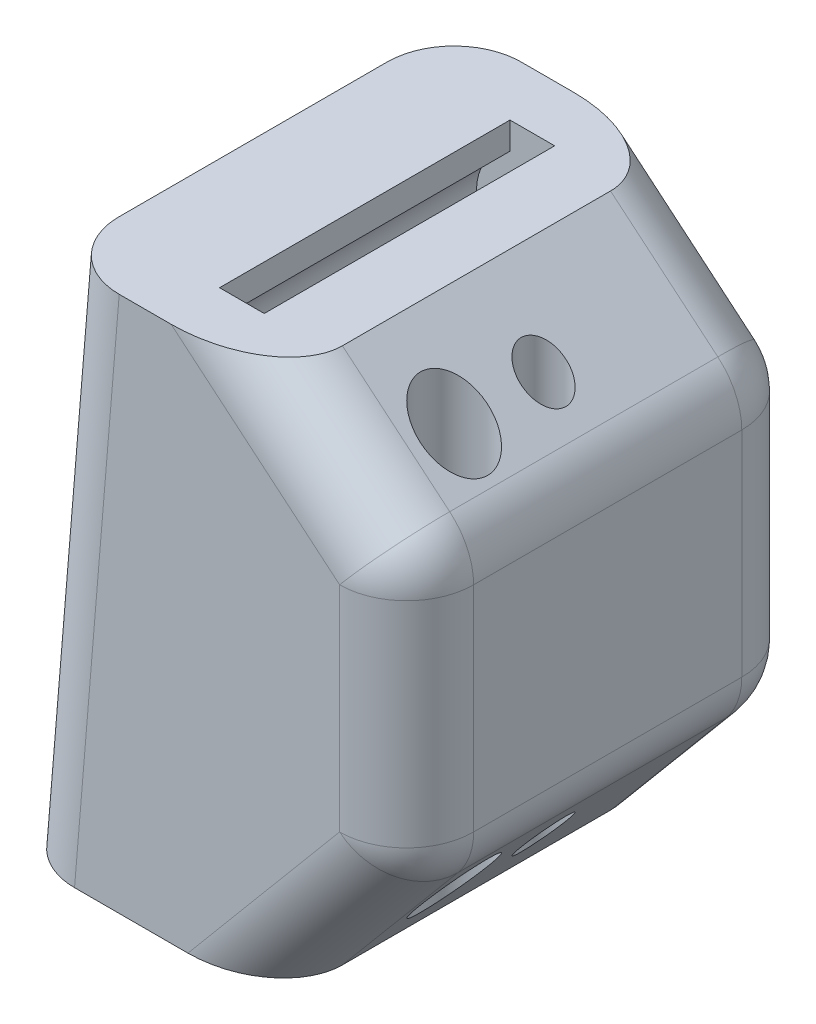
ISO-10303-21;
HEADER;
FILE_DESCRIPTION(('STEP AP214'),'2;1');
FILE_NAME('part.step','',(''),(''),'','','');
FILE_SCHEMA(('AUTOMOTIVE_DESIGN { 1 0 10303 214 1 1 1 1 }'));
ENDSEC;
DATA;
#1=APPLICATION_CONTEXT('core data for automotive mechanical design processes');
#2=APPLICATION_PROTOCOL_DEFINITION('international standard','automotive_design',2000,#1);
#3=PRODUCT_CONTEXT('',#1,'mechanical');
#4=PRODUCT('Part','Part','',(#3));
#5=PRODUCT_RELATED_PRODUCT_CATEGORY('part','',(#4));
#6=PRODUCT_DEFINITION_FORMATION('','',#4);
#7=PRODUCT_DEFINITION_CONTEXT('part definition',#1,'design');
#8=PRODUCT_DEFINITION('design','',#6,#7);
#9=PRODUCT_DEFINITION_SHAPE('','',#8);
#10=(LENGTH_UNIT() NAMED_UNIT(*) SI_UNIT(.MILLI.,.METRE.));
#11=(NAMED_UNIT(*) PLANE_ANGLE_UNIT() SI_UNIT($,.RADIAN.));
#12=(NAMED_UNIT(*) SI_UNIT($,.STERADIAN.) SOLID_ANGLE_UNIT());
#13=UNCERTAINTY_MEASURE_WITH_UNIT(LENGTH_MEASURE(1.E-05),#10,'distance_accuracy_value','');
#14=(GEOMETRIC_REPRESENTATION_CONTEXT(3) GLOBAL_UNCERTAINTY_ASSIGNED_CONTEXT((#13)) GLOBAL_UNIT_ASSIGNED_CONTEXT((#10,
#11,#12)) REPRESENTATION_CONTEXT('',''));
#15=CARTESIAN_POINT('',(0.,0.,0.));
#16=DIRECTION('',(0.,0.,1.));
#17=DIRECTION('',(1.,0.,0.));
#18=AXIS2_PLACEMENT_3D('',#15,#16,#17);
#19=CARTESIAN_POINT('',(0.,0.,18.));
#20=DIRECTION('',(0.,1.,0.));
#21=DIRECTION('',(0.,0.,1.));
#22=AXIS2_PLACEMENT_3D('',#19,#20,#21);
#23=PLANE('',#22);
#24=DIRECTION('',(1.,0.,0.));
#25=VECTOR('',#24,1.);
#26=CARTESIAN_POINT('',(0.,0.,0.));
#27=LINE('',#26,#25);
#28=CARTESIAN_POINT('',(3.01039864469807,0.,0.));
#29=VERTEX_POINT('',#28);
#30=CARTESIAN_POINT('',(8.08377813200317,0.,0.));
#31=VERTEX_POINT('',#30);
#32=EDGE_CURVE('E286',#29,#31,#27,.T.);
#33=ORIENTED_EDGE('',*,*,#32,.T.);
#34=CARTESIAN_POINT('',(8.08377813200317,0.,3.));
#35=DIRECTION('',(0.,1.,0.));
#36=DIRECTION('',(-1.,0.,0.));
#37=AXIS2_PLACEMENT_3D('',#34,#35,#36);
#38=ELLIPSE('',#37,3.91622186799683,3.);
#39=CARTESIAN_POINT('',(12.,0.,3.));
#40=VERTEX_POINT('',#39);
#41=EDGE_CURVE('E382',#31,#40,#38,.F.);
#42=ORIENTED_EDGE('',*,*,#41,.T.);
#43=DIRECTION('',(0.,0.,-1.));
#44=VECTOR('',#43,1.);
#45=CARTESIAN_POINT('',(12.,0.,18.));
#46=LINE('',#45,#44);
#47=CARTESIAN_POINT('',(12.,0.,15.));
#48=VERTEX_POINT('',#47);
#49=EDGE_CURVE('E336',#48,#40,#46,.T.);
#50=ORIENTED_EDGE('',*,*,#49,.F.);
#51=CARTESIAN_POINT('',(8.08377813200317,0.,15.));
#52=DIRECTION('',(0.,1.,0.));
#53=DIRECTION('',(1.,0.,0.));
#54=AXIS2_PLACEMENT_3D('',#51,#52,#53);
#55=ELLIPSE('',#54,3.91622186799683,3.);
#56=CARTESIAN_POINT('',(8.08377813200317,0.,18.));
#57=VERTEX_POINT('',#56);
#58=EDGE_CURVE('E379',#48,#57,#55,.F.);
#59=ORIENTED_EDGE('',*,*,#58,.T.);
#60=DIRECTION('',(1.,0.,0.));
#61=VECTOR('',#60,1.);
#62=CARTESIAN_POINT('',(0.,0.,18.));
#63=LINE('',#62,#61);
#64=CARTESIAN_POINT('',(3.01039864469807,0.,18.));
#65=VERTEX_POINT('',#64);
#66=EDGE_CURVE('E297',#65,#57,#63,.T.);
#67=ORIENTED_EDGE('',*,*,#66,.F.);
#68=CARTESIAN_POINT('',(3.01039864469807,0.,15.));
#69=DIRECTION('',(0.,1.,0.));
#70=DIRECTION('',(-1.,0.,0.));
#71=AXIS2_PLACEMENT_3D('',#68,#69,#70);
#72=ELLIPSE('',#71,3.01039864469807,3.);
#73=CARTESIAN_POINT('',(0.,0.,15.));
#74=VERTEX_POINT('',#73);
#75=EDGE_CURVE('E373',#65,#74,#72,.F.);
#76=ORIENTED_EDGE('',*,*,#75,.T.);
#77=DIRECTION('',(0.,0.,-1.));
#78=VECTOR('',#77,1.);
#79=CARTESIAN_POINT('',(0.,0.,18.));
#80=LINE('',#79,#78);
#81=CARTESIAN_POINT('',(0.,0.,3.));
#82=VERTEX_POINT('',#81);
#83=EDGE_CURVE('E340',#74,#82,#80,.T.);
#84=ORIENTED_EDGE('',*,*,#83,.T.);
#85=CARTESIAN_POINT('',(3.01039864469807,0.,3.));
#86=DIRECTION('',(0.,1.,0.));
#87=DIRECTION('',(1.,0.,0.));
#88=AXIS2_PLACEMENT_3D('',#85,#86,#87);
#89=ELLIPSE('',#88,3.01039864469807,3.);
#90=EDGE_CURVE('E376',#82,#29,#89,.F.);
#91=ORIENTED_EDGE('',*,*,#90,.T.);
#92=EDGE_LOOP('',(#33,#42,#50,#59,#67,#76,#84,#91));
#93=FACE_BOUND('',#92,.T.);
#94=DIRECTION('',(-1.,0.,0.));
#95=VECTOR('',#94,1.);
#96=CARTESIAN_POINT('',(9.,0.,15.5));
#97=LINE('',#96,#95);
#98=CARTESIAN_POINT('',(9.,0.,15.5));
#99=VERTEX_POINT('',#98);
#100=CARTESIAN_POINT('',(7.,0.,15.5));
#101=VERTEX_POINT('',#100);
#102=EDGE_CURVE('E215',#99,#101,#97,.T.);
#103=ORIENTED_EDGE('',*,*,#102,.F.);
#104=DIRECTION('',(0.,0.,-1.));
#105=VECTOR('',#104,1.);
#106=CARTESIAN_POINT('',(9.,0.,15.5));
#107=LINE('',#106,#105);
#108=CARTESIAN_POINT('',(9.,0.,2.5));
#109=VERTEX_POINT('',#108);
#110=EDGE_CURVE('E205',#99,#109,#107,.T.);
#111=ORIENTED_EDGE('',*,*,#110,.T.);
#112=DIRECTION('',(-1.,0.,0.));
#113=VECTOR('',#112,1.);
#114=CARTESIAN_POINT('',(9.,0.,2.5));
#115=LINE('',#114,#113);
#116=CARTESIAN_POINT('',(7.,0.,2.5));
#117=VERTEX_POINT('',#116);
#118=EDGE_CURVE('E224',#109,#117,#115,.T.);
#119=ORIENTED_EDGE('',*,*,#118,.T.);
#120=DIRECTION('',(0.,0.,-1.));
#121=VECTOR('',#120,1.);
#122=CARTESIAN_POINT('',(7.,0.,15.5));
#123=LINE('',#122,#121);
#124=EDGE_CURVE('E246',#101,#117,#123,.T.);
#125=ORIENTED_EDGE('',*,*,#124,.F.);
#126=EDGE_LOOP('',(#103,#111,#119,#125));
#127=FACE_BOUND('',#126,.T.);
#128=ADVANCED_FACE('F39',(#93,#127),#23,.F.);
#129=CARTESIAN_POINT('',(2.,24.,18.));
#130=DIRECTION('',(0.,-1.,0.));
#131=DIRECTION('',(0.,0.,-1.));
#132=AXIS2_PLACEMENT_3D('',#129,#130,#131);
#133=PLANE('',#132);
#134=DIRECTION('',(0.,0.,-1.));
#135=VECTOR('',#134,1.);
#136=CARTESIAN_POINT('',(12.,24.,18.));
#137=LINE('',#136,#135);
#138=CARTESIAN_POINT('',(12.,24.,15.));
#139=VERTEX_POINT('',#138);
#140=CARTESIAN_POINT('',(12.,24.,3.));
#141=VERTEX_POINT('',#140);
#142=EDGE_CURVE('E316',#139,#141,#137,.T.);
#143=ORIENTED_EDGE('',*,*,#142,.T.);
#144=CARTESIAN_POINT('',(7.33282851941877,24.,3.));
#145=DIRECTION('',(0.,-1.,0.));
#146=DIRECTION('',(1.,0.,0.));
#147=AXIS2_PLACEMENT_3D('',#144,#145,#146);
#148=ELLIPSE('',#147,4.66717148058123,3.);
#149=CARTESIAN_POINT('',(7.33282851941877,24.,0.));
#150=VERTEX_POINT('',#149);
#151=EDGE_CURVE('E406',#141,#150,#148,.F.);
#152=ORIENTED_EDGE('',*,*,#151,.T.);
#153=DIRECTION('',(-1.,0.,0.));
#154=VECTOR('',#153,1.);
#155=CARTESIAN_POINT('',(2.,24.,0.));
#156=LINE('',#155,#154);
#157=CARTESIAN_POINT('',(5.01039864469807,24.,0.));
#158=VERTEX_POINT('',#157);
#159=EDGE_CURVE('E302',#150,#158,#156,.T.);
#160=ORIENTED_EDGE('',*,*,#159,.T.);
#161=CARTESIAN_POINT('',(5.01039864469807,24.,3.));
#162=DIRECTION('',(0.,-1.,0.));
#163=DIRECTION('',(1.,0.,0.));
#164=AXIS2_PLACEMENT_3D('',#161,#162,#163);
#165=ELLIPSE('',#164,3.01039864469807,3.);
#166=CARTESIAN_POINT('',(2.,24.,3.));
#167=VERTEX_POINT('',#166);
#168=EDGE_CURVE('E400',#158,#167,#165,.F.);
#169=ORIENTED_EDGE('',*,*,#168,.T.);
#170=DIRECTION('',(0.,0.,-1.));
#171=VECTOR('',#170,1.);
#172=CARTESIAN_POINT('',(2.,24.,18.));
#173=LINE('',#172,#171);
#174=CARTESIAN_POINT('',(2.,24.,15.));
#175=VERTEX_POINT('',#174);
#176=EDGE_CURVE('E306',#175,#167,#173,.T.);
#177=ORIENTED_EDGE('',*,*,#176,.F.);
#178=CARTESIAN_POINT('',(5.01039864469807,24.,15.));
#179=DIRECTION('',(0.,-1.,0.));
#180=DIRECTION('',(-1.,0.,0.));
#181=AXIS2_PLACEMENT_3D('',#178,#179,#180);
#182=ELLIPSE('',#181,3.01039864469807,3.);
#183=CARTESIAN_POINT('',(5.01039864469807,24.,18.));
#184=VERTEX_POINT('',#183);
#185=EDGE_CURVE('E397',#175,#184,#182,.F.);
#186=ORIENTED_EDGE('',*,*,#185,.T.);
#187=DIRECTION('',(-1.,0.,0.));
#188=VECTOR('',#187,1.);
#189=CARTESIAN_POINT('',(2.,24.,18.));
#190=LINE('',#189,#188);
#191=CARTESIAN_POINT('',(7.33282851941877,24.,18.));
#192=VERTEX_POINT('',#191);
#193=EDGE_CURVE('E301',#192,#184,#190,.T.);
#194=ORIENTED_EDGE('',*,*,#193,.F.);
#195=CARTESIAN_POINT('',(7.33282851941878,24.,15.));
#196=DIRECTION('',(0.,-1.,0.));
#197=DIRECTION('',(-1.,0.,0.));
#198=AXIS2_PLACEMENT_3D('',#195,#196,#197);
#199=ELLIPSE('',#198,4.66717148058123,3.);
#200=EDGE_CURVE('E403',#192,#139,#199,.F.);
#201=ORIENTED_EDGE('',*,*,#200,.T.);
#202=EDGE_LOOP('',(#143,#152,#160,#169,#177,#186,#194,#201));
#203=FACE_BOUND('',#202,.T.);
#204=DIRECTION('',(-1.,0.,0.));
#205=VECTOR('',#204,1.);
#206=CARTESIAN_POINT('',(7.,24.,2.5));
#207=LINE('',#206,#205);
#208=CARTESIAN_POINT('',(9.,24.,2.5));
#209=VERTEX_POINT('',#208);
#210=CARTESIAN_POINT('',(7.,24.,2.5));
#211=VERTEX_POINT('',#210);
#212=EDGE_CURVE('E261',#209,#211,#207,.T.);
#213=ORIENTED_EDGE('',*,*,#212,.F.);
#214=DIRECTION('',(0.,0.,1.));
#215=VECTOR('',#214,1.);
#216=CARTESIAN_POINT('',(9.,24.,2.5));
#217=LINE('',#216,#215);
#218=CARTESIAN_POINT('',(9.,24.,15.5));
#219=VERTEX_POINT('',#218);
#220=EDGE_CURVE('E291',#209,#219,#217,.T.);
#221=ORIENTED_EDGE('',*,*,#220,.T.);
#222=DIRECTION('',(-1.,0.,0.));
#223=VECTOR('',#222,1.);
#224=CARTESIAN_POINT('',(7.,24.,15.5));
#225=LINE('',#224,#223);
#226=CARTESIAN_POINT('',(7.,24.,15.5));
#227=VERTEX_POINT('',#226);
#228=EDGE_CURVE('E276',#219,#227,#225,.T.);
#229=ORIENTED_EDGE('',*,*,#228,.T.);
#230=DIRECTION('',(0.,0.,1.));
#231=VECTOR('',#230,1.);
#232=CARTESIAN_POINT('',(7.,24.,2.5));
#233=LINE('',#232,#231);
#234=EDGE_CURVE('E287',#211,#227,#233,.T.);
#235=ORIENTED_EDGE('',*,*,#234,.F.);
#236=EDGE_LOOP('',(#213,#221,#229,#235));
#237=FACE_BOUND('',#236,.T.);
#238=ADVANCED_FACE('F474',(#203,#237),#133,.F.);
#239=CARTESIAN_POINT('',(0.,0.,18.));
#240=DIRECTION('',(0.99654575824488,-0.0830454798537398,0.));
#241=DIRECTION('',(0.0830454798537398,0.99654575824488,0.));
#242=AXIS2_PLACEMENT_3D('',#239,#240,#241);
#243=PLANE('',#242);
#244=ORIENTED_EDGE('',*,*,#176,.T.);
#245=DIRECTION('',(-0.0830454798537398,-0.99654575824488,0.));
#246=VECTOR('',#245,1.);
#247=CARTESIAN_POINT('',(0.,0.,3.));
#248=LINE('',#247,#246);
#249=EDGE_CURVE('E430',#167,#82,#248,.T.);
#250=ORIENTED_EDGE('',*,*,#249,.T.);
#251=ORIENTED_EDGE('',*,*,#83,.F.);
#252=DIRECTION('',(-0.0830454798537398,-0.99654575824488,0.));
#253=VECTOR('',#252,1.);
#254=CARTESIAN_POINT('',(0.,0.,15.));
#255=LINE('',#254,#253);
#256=EDGE_CURVE('E427',#74,#175,#255,.F.);
#257=ORIENTED_EDGE('',*,*,#256,.T.);
#258=EDGE_LOOP('',(#244,#250,#251,#257));
#259=FACE_BOUND('',#258,.T.);
#260=ADVANCED_FACE('F508',(#259),#243,.F.);
#261=CARTESIAN_POINT('',(12.,0.,18.));
#262=DIRECTION('',(-0.76604444311898,0.642787609686537,0.));
#263=DIRECTION('',(-0.642787609686537,-0.76604444311898,0.));
#264=AXIS2_PLACEMENT_3D('',#261,#262,#263);
#265=PLANE('',#264);
#266=CARTESIAN_POINT('',(15.,3.57526077778265,9.));
#267=DIRECTION('',(-0.76604444311898,0.642787609686537,0.));
#268=DIRECTION('',(-0.642787609686537,-0.76604444311898,0.));
#269=AXIS2_PLACEMENT_3D('',#266,#267,#268);
#270=ELLIPSE('',#269,1.55572382686042,1.);
#271=CARTESIAN_POINT('',(14.,2.38350718518843,9.));
#272=VERTEX_POINT('',#271);
#273=EDGE_CURVE('E227',#272,#272,#270,.F.);
#274=ORIENTED_EDGE('',*,*,#273,.F.);
#275=EDGE_LOOP('',(#274));
#276=FACE_BOUND('',#275,.T.);
#277=CARTESIAN_POINT('',(15.,3.57526077778265,13.));
#278=DIRECTION('',(-0.76604444311898,0.642787609686537,0.));
#279=DIRECTION('',(-0.642787609686537,-0.76604444311898,0.));
#280=AXIS2_PLACEMENT_3D('',#277,#278,#279);
#281=ELLIPSE('',#280,2.33358574029063,1.5);
#282=CARTESIAN_POINT('',(13.5,1.78763038889132,13.));
#283=VERTEX_POINT('',#282);
#284=EDGE_CURVE('E349',#283,#283,#281,.F.);
#285=ORIENTED_EDGE('',*,*,#284,.F.);
#286=EDGE_LOOP('',(#285));
#287=FACE_BOUND('',#286,.T.);
#288=ORIENTED_EDGE('',*,*,#49,.T.);
#289=DIRECTION('',(0.642787609686537,0.76604444311898,0.));
#290=VECTOR('',#289,1.);
#291=CARTESIAN_POINT('',(17.1718307475979,6.16354787373898,3.));
#292=LINE('',#291,#290);
#293=CARTESIAN_POINT('',(17.1718307475979,6.16354787373898,3.));
#294=VERTEX_POINT('',#293);
#295=EDGE_CURVE('E357',#40,#294,#292,.T.);
#296=ORIENTED_EDGE('',*,*,#295,.T.);
#297=DIRECTION('',(0.,0.,-1.));
#298=VECTOR('',#297,1.);
#299=CARTESIAN_POINT('',(17.1718307475979,6.16354787373898,18.));
#300=LINE('',#299,#298);
#301=CARTESIAN_POINT('',(17.1718307475979,6.16354787373898,15.));
#302=VERTEX_POINT('',#301);
#303=EDGE_CURVE('E332',#302,#294,#300,.T.);
#304=ORIENTED_EDGE('',*,*,#303,.F.);
#305=DIRECTION('',(0.642787609686537,0.76604444311898,0.));
#306=VECTOR('',#305,1.);
#307=CARTESIAN_POINT('',(12.,0.,15.));
#308=LINE('',#307,#306);
#309=EDGE_CURVE('E344',#302,#48,#308,.F.);
#310=ORIENTED_EDGE('',*,*,#309,.T.);
#311=EDGE_LOOP('',(#288,#296,#304,#310));
#312=FACE_BOUND('',#311,.T.);
#313=ADVANCED_FACE('F512',(#276,#287,#312),#265,.F.);
#314=CARTESIAN_POINT('',(14.8736974182409,8.0919107027986,18.));
#315=DIRECTION('',(0.,0.,-1.));
#316=DIRECTION('',(-1.,0.,0.));
#317=AXIS2_PLACEMENT_3D('',#314,#315,#316);
#318=CYLINDRICAL_SURFACE('',#317,3.);
#319=ORIENTED_EDGE('',*,*,#303,.T.);
#320=CARTESIAN_POINT('',(14.8736974182409,8.0919107027986,3.));
#321=DIRECTION('',(0.,0.,-1.));
#322=DIRECTION('',(-1.,0.,0.));
#323=AXIS2_PLACEMENT_3D('',#320,#321,#322);
#324=CIRCLE('',#323,3.);
#325=CARTESIAN_POINT('',(17.8736974182409,8.0919107027986,3.));
#326=VERTEX_POINT('',#325);
#327=EDGE_CURVE('E388',#294,#326,#324,.F.);
#328=ORIENTED_EDGE('',*,*,#327,.T.);
#329=DIRECTION('',(0.,0.,-1.));
#330=VECTOR('',#329,1.);
#331=CARTESIAN_POINT('',(17.8736974182409,8.0919107027986,18.));
#332=LINE('',#331,#330);
#333=CARTESIAN_POINT('',(17.8736974182409,8.0919107027986,15.));
#334=VERTEX_POINT('',#333);
#335=EDGE_CURVE('E328',#334,#326,#332,.T.);
#336=ORIENTED_EDGE('',*,*,#335,.F.);
#337=CARTESIAN_POINT('',(14.8736974182409,8.0919107027986,15.));
#338=DIRECTION('',(0.,0.,-1.));
#339=DIRECTION('',(-1.,0.,0.));
#340=AXIS2_PLACEMENT_3D('',#337,#338,#339);
#341=CIRCLE('',#340,3.);
#342=EDGE_CURVE('E385',#334,#302,#341,.T.);
#343=ORIENTED_EDGE('',*,*,#342,.T.);
#344=EDGE_LOOP('',(#319,#328,#336,#343));
#345=FACE_BOUND('',#344,.T.);
#346=ADVANCED_FACE('F764',(#345),#318,.T.);
#347=CARTESIAN_POINT('',(17.8736974182409,17.6724596882421,18.));
#348=DIRECTION('',(-1.,0.,0.));
#349=DIRECTION('',(0.,-1.,0.));
#350=AXIS2_PLACEMENT_3D('',#347,#348,#349);
#351=PLANE('',#350);
#352=ORIENTED_EDGE('',*,*,#335,.T.);
#353=DIRECTION('',(0.,1.,0.));
#354=VECTOR('',#353,1.);
#355=CARTESIAN_POINT('',(17.8736974182409,17.6724596882421,3.));
#356=LINE('',#355,#354);
#357=CARTESIAN_POINT('',(17.8736974182409,17.6724596882421,3.));
#358=VERTEX_POINT('',#357);
#359=EDGE_CURVE('E11',#326,#358,#356,.T.);
#360=ORIENTED_EDGE('',*,*,#359,.T.);
#361=DIRECTION('',(0.,0.,-1.));
#362=VECTOR('',#361,1.);
#363=CARTESIAN_POINT('',(17.8736974182409,17.6724596882421,18.));
#364=LINE('',#363,#362);
#365=CARTESIAN_POINT('',(17.8736974182409,17.6724596882421,15.));
#366=VERTEX_POINT('',#365);
#367=EDGE_CURVE('E324',#366,#358,#364,.T.);
#368=ORIENTED_EDGE('',*,*,#367,.F.);
#369=DIRECTION('',(0.,1.,0.));
#370=VECTOR('',#369,1.);
#371=CARTESIAN_POINT('',(17.8736974182409,17.6724596882421,15.));
#372=LINE('',#371,#370);
#373=EDGE_CURVE('E49',#366,#334,#372,.F.);
#374=ORIENTED_EDGE('',*,*,#373,.T.);
#375=EDGE_LOOP('',(#352,#360,#368,#374));
#376=FACE_BOUND('',#375,.T.);
#377=ADVANCED_FACE('F755',(#376),#351,.F.);
#378=CARTESIAN_POINT('',(14.8736974182409,17.6724596882421,18.));
#379=DIRECTION('',(0.,0.,-1.));
#380=DIRECTION('',(-1.,0.,0.));
#381=AXIS2_PLACEMENT_3D('',#378,#379,#380);
#382=CYLINDRICAL_SURFACE('',#381,3.);
#383=ORIENTED_EDGE('',*,*,#367,.T.);
#384=CARTESIAN_POINT('',(14.8736974182409,17.6724596882421,3.));
#385=DIRECTION('',(0.,0.,-1.));
#386=DIRECTION('',(-1.,0.,0.));
#387=AXIS2_PLACEMENT_3D('',#384,#385,#386);
#388=CIRCLE('',#387,3.);
#389=CARTESIAN_POINT('',(16.8020602473005,19.970593017599,3.));
#390=VERTEX_POINT('',#389);
#391=EDGE_CURVE('E412',#358,#390,#388,.F.);
#392=ORIENTED_EDGE('',*,*,#391,.T.);
#393=DIRECTION('',(0.,0.,-1.));
#394=VECTOR('',#393,1.);
#395=CARTESIAN_POINT('',(16.8020602473005,19.970593017599,18.));
#396=LINE('',#395,#394);
#397=CARTESIAN_POINT('',(16.8020602473005,19.970593017599,15.));
#398=VERTEX_POINT('',#397);
#399=EDGE_CURVE('E320',#398,#390,#396,.T.);
#400=ORIENTED_EDGE('',*,*,#399,.F.);
#401=CARTESIAN_POINT('',(14.8736974182409,17.6724596882421,15.));
#402=DIRECTION('',(0.,0.,-1.));
#403=DIRECTION('',(-1.,0.,0.));
#404=AXIS2_PLACEMENT_3D('',#401,#402,#403);
#405=CIRCLE('',#404,3.);
#406=EDGE_CURVE('E409',#398,#366,#405,.T.);
#407=ORIENTED_EDGE('',*,*,#406,.T.);
#408=EDGE_LOOP('',(#383,#392,#400,#407));
#409=FACE_BOUND('',#408,.T.);
#410=ADVANCED_FACE('F746',(#409),#382,.T.);
#411=CARTESIAN_POINT('',(12.,24.,18.));
#412=DIRECTION('',(-0.642787609686541,-0.766044443118977,0.));
#413=DIRECTION('',(0.766044443118977,-0.642787609686541,0.));
#414=AXIS2_PLACEMENT_3D('',#411,#412,#413);
#415=PLANE('',#414);
#416=CARTESIAN_POINT('',(15.,21.4827011064681,9.));
#417=DIRECTION('',(-0.642787609686541,-0.766044443118977,0.));
#418=DIRECTION('',(0.766044443118977,-0.642787609686541,0.));
#419=AXIS2_PLACEMENT_3D('',#416,#417,#418);
#420=ELLIPSE('',#419,1.30540728933228,1.);
#421=CARTESIAN_POINT('',(16.,20.6436014752909,9.));
#422=VERTEX_POINT('',#421);
#423=EDGE_CURVE('E351',#422,#422,#420,.F.);
#424=ORIENTED_EDGE('',*,*,#423,.F.);
#425=EDGE_LOOP('',(#424));
#426=FACE_BOUND('',#425,.T.);
#427=CARTESIAN_POINT('',(15.,21.4827011064681,13.));
#428=DIRECTION('',(-0.642787609686541,-0.766044443118977,0.));
#429=DIRECTION('',(0.766044443118977,-0.642787609686541,0.));
#430=AXIS2_PLACEMENT_3D('',#427,#428,#429);
#431=ELLIPSE('',#430,1.95811093399842,1.5);
#432=CARTESIAN_POINT('',(16.5,20.2240516597022,13.));
#433=VERTEX_POINT('',#432);
#434=EDGE_CURVE('E345',#433,#433,#431,.F.);
#435=ORIENTED_EDGE('',*,*,#434,.F.);
#436=EDGE_LOOP('',(#435));
#437=FACE_BOUND('',#436,.T.);
#438=ORIENTED_EDGE('',*,*,#399,.T.);
#439=DIRECTION('',(-0.766044443118977,0.642787609686541,0.));
#440=VECTOR('',#439,1.);
#441=CARTESIAN_POINT('',(12.,24.,3.));
#442=LINE('',#441,#440);
#443=EDGE_CURVE('E394',#390,#141,#442,.T.);
#444=ORIENTED_EDGE('',*,*,#443,.T.);
#445=ORIENTED_EDGE('',*,*,#142,.F.);
#446=DIRECTION('',(-0.766044443118977,0.642787609686541,0.));
#447=VECTOR('',#446,1.);
#448=CARTESIAN_POINT('',(12.,24.,15.));
#449=LINE('',#448,#447);
#450=EDGE_CURVE('E391',#139,#398,#449,.F.);
#451=ORIENTED_EDGE('',*,*,#450,.T.);
#452=EDGE_LOOP('',(#438,#444,#445,#451));
#453=FACE_BOUND('',#452,.T.);
#454=ADVANCED_FACE('F738',(#426,#437,#453),#415,.F.);
#455=CARTESIAN_POINT('',(14.8736974182409,17.6724596882421,18.));
#456=DIRECTION('',(0.,0.,-1.));
#457=DIRECTION('',(-1.,0.,0.));
#458=AXIS2_PLACEMENT_3D('',#455,#456,#457);
#459=PLANE('',#458);
#460=ORIENTED_EDGE('',*,*,#193,.T.);
#461=DIRECTION('',(-0.0830454798537398,-0.99654575824488,0.));
#462=VECTOR('',#461,1.);
#463=CARTESIAN_POINT('',(4.55476288630116,18.5323708992371,18.));
#464=LINE('',#463,#462);
#465=EDGE_CURVE('E423',#184,#65,#464,.T.);
#466=ORIENTED_EDGE('',*,*,#465,.T.);
#467=ORIENTED_EDGE('',*,*,#66,.T.);
#468=DIRECTION('',(0.642787609686537,0.76604444311898,0.));
#469=VECTOR('',#468,1.);
#470=CARTESIAN_POINT('',(19.5911968777299,13.7140076317059,18.));
#471=LINE('',#470,#469);
#472=CARTESIAN_POINT('',(14.8736974182409,8.0919107027986,18.));
#473=VERTEX_POINT('',#472);
#474=EDGE_CURVE('E420',#57,#473,#471,.T.);
#475=ORIENTED_EDGE('',*,*,#474,.T.);
#476=DIRECTION('',(0.,1.,0.));
#477=VECTOR('',#476,1.);
#478=CARTESIAN_POINT('',(14.8736974182409,17.6724596882421,18.));
#479=LINE('',#478,#477);
#480=CARTESIAN_POINT('',(14.8736974182409,17.6724596882421,18.));
#481=VERTEX_POINT('',#480);
#482=EDGE_CURVE('E57',#473,#481,#479,.T.);
#483=ORIENTED_EDGE('',*,*,#482,.T.);
#484=DIRECTION('',(-0.766044443118977,0.642787609686541,0.));
#485=VECTOR('',#484,1.);
#486=CARTESIAN_POINT('',(14.8736974182409,17.6724596882421,18.));
#487=LINE('',#486,#485);
#488=EDGE_CURVE('E417',#481,#192,#487,.T.);
#489=ORIENTED_EDGE('',*,*,#488,.T.);
#490=EDGE_LOOP('',(#460,#466,#467,#475,#483,#489));
#491=FACE_BOUND('',#490,.T.);
#492=ADVANCED_FACE('F471',(#491),#459,.F.);
#493=CARTESIAN_POINT('',(14.8736974182409,17.6724596882421,0.));
#494=DIRECTION('',(0.,0.,-1.));
#495=DIRECTION('',(-1.,0.,0.));
#496=AXIS2_PLACEMENT_3D('',#493,#494,#495);
#497=PLANE('',#496);
#498=ORIENTED_EDGE('',*,*,#32,.F.);
#499=DIRECTION('',(-0.0830454798537398,-0.99654575824488,0.));
#500=VECTOR('',#499,1.);
#501=CARTESIAN_POINT('',(4.98963727473464,23.7508635604388,0.));
#502=LINE('',#501,#500);
#503=EDGE_CURVE('E370',#29,#158,#502,.F.);
#504=ORIENTED_EDGE('',*,*,#503,.T.);
#505=ORIENTED_EDGE('',*,*,#159,.F.);
#506=DIRECTION('',(-0.766044443118977,0.642787609686541,0.));
#507=VECTOR('',#506,1.);
#508=CARTESIAN_POINT('',(14.8736974182409,17.6724596882421,0.));
#509=LINE('',#508,#507);
#510=CARTESIAN_POINT('',(14.8736974182409,17.6724596882421,0.));
#511=VERTEX_POINT('',#510);
#512=EDGE_CURVE('E364',#150,#511,#509,.F.);
#513=ORIENTED_EDGE('',*,*,#512,.T.);
#514=DIRECTION('',(0.,1.,0.));
#515=VECTOR('',#514,1.);
#516=CARTESIAN_POINT('',(14.8736974182409,8.09191070279861,0.));
#517=LINE('',#516,#515);
#518=CARTESIAN_POINT('',(14.8736974182409,8.0919107027986,0.));
#519=VERTEX_POINT('',#518);
#520=EDGE_CURVE('E361',#511,#519,#517,.F.);
#521=ORIENTED_EDGE('',*,*,#520,.T.);
#522=DIRECTION('',(0.642787609686537,0.76604444311898,0.));
#523=VECTOR('',#522,1.);
#524=CARTESIAN_POINT('',(9.70186667064306,1.92836282905961,0.));
#525=LINE('',#524,#523);
#526=EDGE_CURVE('E367',#519,#31,#525,.F.);
#527=ORIENTED_EDGE('',*,*,#526,.T.);
#528=EDGE_LOOP('',(#498,#504,#505,#513,#521,#527));
#529=FACE_BOUND('',#528,.T.);
#530=ADVANCED_FACE('F717',(#529),#497,.T.);
#531=CARTESIAN_POINT('',(8.,20.5,2.5));
#532=DIRECTION('',(0.,0.,1.));
#533=DIRECTION('',(1.,0.,0.));
#534=AXIS2_PLACEMENT_3D('',#531,#532,#533);
#535=CYLINDRICAL_SURFACE('',#534,2.5);
#536=CARTESIAN_POINT('',(8.,20.5,15.5));
#537=DIRECTION('',(0.,0.,1.));
#538=DIRECTION('',(1.,0.,0.));
#539=AXIS2_PLACEMENT_3D('',#536,#537,#538);
#540=CIRCLE('',#539,2.5);
#541=CARTESIAN_POINT('',(7.,22.7912878474779,15.5));
#542=VERTEX_POINT('',#541);
#543=CARTESIAN_POINT('',(9.,22.7912878474779,15.5));
#544=VERTEX_POINT('',#543);
#545=EDGE_CURVE('E245',#542,#544,#540,.T.);
#546=ORIENTED_EDGE('',*,*,#545,.T.);
#547=DIRECTION('',(0.,0.,1.));
#548=VECTOR('',#547,1.);
#549=CARTESIAN_POINT('',(9.,22.7912878474779,2.5));
#550=LINE('',#549,#548);
#551=CARTESIAN_POINT('',(9.,22.7912878474779,2.5));
#552=VERTEX_POINT('',#551);
#553=EDGE_CURVE('E268',#552,#544,#550,.T.);
#554=ORIENTED_EDGE('',*,*,#553,.F.);
#555=CARTESIAN_POINT('',(8.,20.5,2.5));
#556=DIRECTION('',(0.,0.,1.));
#557=DIRECTION('',(1.,0.,0.));
#558=AXIS2_PLACEMENT_3D('',#555,#556,#557);
#559=CIRCLE('',#558,2.5);
#560=CARTESIAN_POINT('',(7.,22.7912878474779,2.5));
#561=VERTEX_POINT('',#560);
#562=EDGE_CURVE('E252',#561,#552,#559,.T.);
#563=ORIENTED_EDGE('',*,*,#562,.F.);
#564=DIRECTION('',(0.,0.,1.));
#565=VECTOR('',#564,1.);
#566=CARTESIAN_POINT('',(7.,22.7912878474779,2.5));
#567=LINE('',#566,#565);
#568=EDGE_CURVE('E283',#561,#542,#567,.T.);
#569=ORIENTED_EDGE('',*,*,#568,.T.);
#570=EDGE_LOOP('',(#546,#554,#563,#569));
#571=FACE_BOUND('',#570,.T.);
#572=ADVANCED_FACE('F708',(#571),#535,.F.);
#573=CARTESIAN_POINT('',(7.,24.,2.5));
#574=DIRECTION('',(-1.,0.,0.));
#575=DIRECTION('',(0.,-1.,0.));
#576=AXIS2_PLACEMENT_3D('',#573,#574,#575);
#577=PLANE('',#576);
#578=DIRECTION('',(0.,-1.,0.));
#579=VECTOR('',#578,1.);
#580=CARTESIAN_POINT('',(7.,24.,15.5));
#581=LINE('',#580,#579);
#582=EDGE_CURVE('E257',#227,#542,#581,.T.);
#583=ORIENTED_EDGE('',*,*,#582,.T.);
#584=ORIENTED_EDGE('',*,*,#568,.F.);
#585=DIRECTION('',(0.,-1.,0.));
#586=VECTOR('',#585,1.);
#587=CARTESIAN_POINT('',(7.,24.,2.5));
#588=LINE('',#587,#586);
#589=EDGE_CURVE('E264',#211,#561,#588,.T.);
#590=ORIENTED_EDGE('',*,*,#589,.F.);
#591=ORIENTED_EDGE('',*,*,#234,.T.);
#592=EDGE_LOOP('',(#583,#584,#590,#591));
#593=FACE_BOUND('',#592,.T.);
#594=ADVANCED_FACE('F699',(#593),#577,.F.);
#595=CARTESIAN_POINT('',(9.,24.,2.5));
#596=DIRECTION('',(1.,0.,0.));
#597=DIRECTION('',(0.,0.,-1.));
#598=AXIS2_PLACEMENT_3D('',#595,#596,#597);
#599=PLANE('',#598);
#600=DIRECTION('',(0.,1.,0.));
#601=VECTOR('',#600,1.);
#602=CARTESIAN_POINT('',(9.,24.,15.5));
#603=LINE('',#602,#601);
#604=EDGE_CURVE('E272',#544,#219,#603,.T.);
#605=ORIENTED_EDGE('',*,*,#604,.T.);
#606=ORIENTED_EDGE('',*,*,#220,.F.);
#607=DIRECTION('',(0.,1.,0.));
#608=VECTOR('',#607,1.);
#609=CARTESIAN_POINT('',(9.,24.,2.5));
#610=LINE('',#609,#608);
#611=EDGE_CURVE('E256',#552,#209,#610,.T.);
#612=ORIENTED_EDGE('',*,*,#611,.F.);
#613=ORIENTED_EDGE('',*,*,#553,.T.);
#614=EDGE_LOOP('',(#605,#606,#612,#613));
#615=FACE_BOUND('',#614,.T.);
#616=ADVANCED_FACE('F690',(#615),#599,.F.);
#617=CARTESIAN_POINT('',(8.,20.5,2.5));
#618=DIRECTION('',(0.,0.,1.));
#619=DIRECTION('',(1.,0.,0.));
#620=AXIS2_PLACEMENT_3D('',#617,#618,#619);
#621=PLANE('',#620);
#622=ORIENTED_EDGE('',*,*,#562,.T.);
#623=ORIENTED_EDGE('',*,*,#611,.T.);
#624=ORIENTED_EDGE('',*,*,#212,.T.);
#625=ORIENTED_EDGE('',*,*,#589,.T.);
#626=EDGE_LOOP('',(#622,#623,#624,#625));
#627=FACE_BOUND('',#626,.T.);
#628=ADVANCED_FACE('F681',(#627),#621,.T.);
#629=CARTESIAN_POINT('',(8.,20.5,15.5));
#630=DIRECTION('',(0.,0.,1.));
#631=DIRECTION('',(1.,0.,0.));
#632=AXIS2_PLACEMENT_3D('',#629,#630,#631);
#633=PLANE('',#632);
#634=ORIENTED_EDGE('',*,*,#545,.F.);
#635=ORIENTED_EDGE('',*,*,#582,.F.);
#636=ORIENTED_EDGE('',*,*,#228,.F.);
#637=ORIENTED_EDGE('',*,*,#604,.F.);
#638=EDGE_LOOP('',(#634,#635,#636,#637));
#639=FACE_BOUND('',#638,.T.);
#640=ADVANCED_FACE('F668',(#639),#633,.F.);
#641=CARTESIAN_POINT('',(8.,3.5,15.5));
#642=DIRECTION('',(0.,0.,-1.));
#643=DIRECTION('',(-1.,0.,0.));
#644=AXIS2_PLACEMENT_3D('',#641,#642,#643);
#645=CYLINDRICAL_SURFACE('',#644,2.5);
#646=CARTESIAN_POINT('',(8.,3.5,2.5));
#647=DIRECTION('',(0.,0.,-1.));
#648=DIRECTION('',(-1.,0.,0.));
#649=AXIS2_PLACEMENT_3D('',#646,#647,#648);
#650=CIRCLE('',#649,2.5);
#651=CARTESIAN_POINT('',(7.,1.20871215252208,2.5));
#652=VERTEX_POINT('',#651);
#653=CARTESIAN_POINT('',(9.,1.20871215252208,2.5));
#654=VERTEX_POINT('',#653);
#655=EDGE_CURVE('E200',#652,#654,#650,.T.);
#656=ORIENTED_EDGE('',*,*,#655,.T.);
#657=DIRECTION('',(0.,0.,-1.));
#658=VECTOR('',#657,1.);
#659=CARTESIAN_POINT('',(9.,1.20871215252208,15.5));
#660=LINE('',#659,#658);
#661=CARTESIAN_POINT('',(9.,1.20871215252208,15.5));
#662=VERTEX_POINT('',#661);
#663=EDGE_CURVE('E193',#662,#654,#660,.T.);
#664=ORIENTED_EDGE('',*,*,#663,.F.);
#665=CARTESIAN_POINT('',(8.,3.5,15.5));
#666=DIRECTION('',(0.,0.,-1.));
#667=DIRECTION('',(-1.,0.,0.));
#668=AXIS2_PLACEMENT_3D('',#665,#666,#667);
#669=CIRCLE('',#668,2.5);
#670=CARTESIAN_POINT('',(7.,1.20871215252208,15.5));
#671=VERTEX_POINT('',#670);
#672=EDGE_CURVE('E197',#671,#662,#669,.T.);
#673=ORIENTED_EDGE('',*,*,#672,.F.);
#674=DIRECTION('',(0.,0.,-1.));
#675=VECTOR('',#674,1.);
#676=CARTESIAN_POINT('',(7.,1.20871215252208,15.5));
#677=LINE('',#676,#675);
#678=EDGE_CURVE('E242',#671,#652,#677,.T.);
#679=ORIENTED_EDGE('',*,*,#678,.T.);
#680=EDGE_LOOP('',(#656,#664,#673,#679));
#681=FACE_BOUND('',#680,.T.);
#682=ADVANCED_FACE('F195',(#681),#645,.F.);
#683=CARTESIAN_POINT('',(7.,0.,15.5));
#684=DIRECTION('',(-1.,0.,0.));
#685=DIRECTION('',(0.,0.,1.));
#686=AXIS2_PLACEMENT_3D('',#683,#684,#685);
#687=PLANE('',#686);
#688=DIRECTION('',(0.,1.,0.));
#689=VECTOR('',#688,1.);
#690=CARTESIAN_POINT('',(7.,0.,2.5));
#691=LINE('',#690,#689);
#692=EDGE_CURVE('E220',#117,#652,#691,.T.);
#693=ORIENTED_EDGE('',*,*,#692,.T.);
#694=ORIENTED_EDGE('',*,*,#678,.F.);
#695=DIRECTION('',(0.,1.,0.));
#696=VECTOR('',#695,1.);
#697=CARTESIAN_POINT('',(7.,0.,15.5));
#698=LINE('',#697,#696);
#699=EDGE_CURVE('E206',#101,#671,#698,.T.);
#700=ORIENTED_EDGE('',*,*,#699,.F.);
#701=ORIENTED_EDGE('',*,*,#124,.T.);
#702=EDGE_LOOP('',(#693,#694,#700,#701));
#703=FACE_BOUND('',#702,.T.);
#704=ADVANCED_FACE('F652',(#703),#687,.F.);
#705=CARTESIAN_POINT('',(9.,0.,15.5));
#706=DIRECTION('',(1.,0.,0.));
#707=DIRECTION('',(0.,0.,-1.));
#708=AXIS2_PLACEMENT_3D('',#705,#706,#707);
#709=PLANE('',#708);
#710=DIRECTION('',(0.,-1.,0.));
#711=VECTOR('',#710,1.);
#712=CARTESIAN_POINT('',(9.,0.,2.5));
#713=LINE('',#712,#711);
#714=EDGE_CURVE('E236',#654,#109,#713,.T.);
#715=ORIENTED_EDGE('',*,*,#714,.T.);
#716=ORIENTED_EDGE('',*,*,#110,.F.);
#717=DIRECTION('',(0.,-1.,0.));
#718=VECTOR('',#717,1.);
#719=CARTESIAN_POINT('',(9.,0.,15.5));
#720=LINE('',#719,#718);
#721=EDGE_CURVE('E209',#662,#99,#720,.T.);
#722=ORIENTED_EDGE('',*,*,#721,.F.);
#723=ORIENTED_EDGE('',*,*,#663,.T.);
#724=EDGE_LOOP('',(#715,#716,#722,#723));
#725=FACE_BOUND('',#724,.T.);
#726=ADVANCED_FACE('F210',(#725),#709,.F.);
#727=CARTESIAN_POINT('',(8.,3.5,15.5));
#728=DIRECTION('',(0.,0.,-1.));
#729=DIRECTION('',(-1.,0.,0.));
#730=AXIS2_PLACEMENT_3D('',#727,#728,#729);
#731=PLANE('',#730);
#732=ORIENTED_EDGE('',*,*,#672,.T.);
#733=ORIENTED_EDGE('',*,*,#721,.T.);
#734=ORIENTED_EDGE('',*,*,#102,.T.);
#735=ORIENTED_EDGE('',*,*,#699,.T.);
#736=EDGE_LOOP('',(#732,#733,#734,#735));
#737=FACE_BOUND('',#736,.T.);
#738=ADVANCED_FACE('F217',(#737),#731,.T.);
#739=CARTESIAN_POINT('',(8.,3.5,2.5));
#740=DIRECTION('',(0.,0.,-1.));
#741=DIRECTION('',(-1.,0.,0.));
#742=AXIS2_PLACEMENT_3D('',#739,#740,#741);
#743=PLANE('',#742);
#744=ORIENTED_EDGE('',*,*,#655,.F.);
#745=ORIENTED_EDGE('',*,*,#692,.F.);
#746=ORIENTED_EDGE('',*,*,#118,.F.);
#747=ORIENTED_EDGE('',*,*,#714,.F.);
#748=EDGE_LOOP('',(#744,#745,#746,#747));
#749=FACE_BOUND('',#748,.T.);
#750=ADVANCED_FACE('F628',(#749),#743,.F.);
#751=CARTESIAN_POINT('',(15.,25.,13.));
#752=DIRECTION('',(0.,-1.,0.));
#753=DIRECTION('',(0.,0.,-1.));
#754=AXIS2_PLACEMENT_3D('',#751,#752,#753);
#755=CYLINDRICAL_SURFACE('',#754,1.5);
#756=ORIENTED_EDGE('',*,*,#434,.T.);
#757=EDGE_LOOP('',(#756));
#758=FACE_BOUND('',#757,.T.);
#759=ORIENTED_EDGE('',*,*,#284,.T.);
#760=EDGE_LOOP('',(#759));
#761=FACE_BOUND('',#760,.T.);
#762=ADVANCED_FACE('F619',(#758,#761),#755,.F.);
#763=CARTESIAN_POINT('',(15.,25.,9.));
#764=DIRECTION('',(0.,-1.,0.));
#765=DIRECTION('',(0.,0.,-1.));
#766=AXIS2_PLACEMENT_3D('',#763,#764,#765);
#767=CYLINDRICAL_SURFACE('',#766,1.);
#768=ORIENTED_EDGE('',*,*,#423,.T.);
#769=EDGE_LOOP('',(#768));
#770=FACE_BOUND('',#769,.T.);
#771=ORIENTED_EDGE('',*,*,#273,.T.);
#772=EDGE_LOOP('',(#771));
#773=FACE_BOUND('',#772,.T.);
#774=ADVANCED_FACE('F536',(#770,#773),#767,.F.);
#775=CARTESIAN_POINT('',(10.0716371709404,21.7018666706431,3.));
#776=DIRECTION('',(0.766044443118977,-0.642787609686541,0.));
#777=DIRECTION('',(0.642787609686541,0.766044443118977,0.));
#778=AXIS2_PLACEMENT_3D('',#775,#776,#777);
#779=CYLINDRICAL_SURFACE('',#778,3.);
#780=ORIENTED_EDGE('',*,*,#151,.F.);
#781=ORIENTED_EDGE('',*,*,#443,.F.);
#782=CARTESIAN_POINT('',(14.8736974182409,17.6724596882421,3.));
#783=DIRECTION('',(0.766044443118977,-0.642787609686541,0.));
#784=DIRECTION('',(0.642787609686541,0.766044443118977,0.));
#785=AXIS2_PLACEMENT_3D('',#782,#783,#784);
#786=CIRCLE('',#785,3.);
#787=EDGE_CURVE('E350',#511,#390,#786,.T.);
#788=ORIENTED_EDGE('',*,*,#787,.F.);
#789=ORIENTED_EDGE('',*,*,#512,.F.);
#790=EDGE_LOOP('',(#780,#781,#788,#789));
#791=FACE_BOUND('',#790,.T.);
#792=ADVANCED_FACE('F532',(#791),#779,.T.);
#793=CARTESIAN_POINT('',(14.8736974182409,17.6724596882421,3.));
#794=DIRECTION('',(0.,0.,-1.));
#795=DIRECTION('',(-1.,0.,0.));
#796=AXIS2_PLACEMENT_3D('',#793,#794,#795);
#797=SPHERICAL_SURFACE('',#796,3.);
#798=ORIENTED_EDGE('',*,*,#787,.T.);
#799=ORIENTED_EDGE('',*,*,#391,.F.);
#800=CARTESIAN_POINT('',(14.8736974182409,17.6724596882421,3.));
#801=DIRECTION('',(0.,-1.,0.));
#802=DIRECTION('',(0.,0.,-1.));
#803=AXIS2_PLACEMENT_3D('',#800,#801,#802);
#804=CIRCLE('',#803,3.);
#805=EDGE_CURVE('E443',#511,#358,#804,.T.);
#806=ORIENTED_EDGE('',*,*,#805,.F.);
#807=EDGE_LOOP('',(#798,#799,#806));
#808=FACE_BOUND('',#807,.T.);
#809=ADVANCED_FACE('F528',(#808),#797,.T.);
#810=CARTESIAN_POINT('',(14.8736974182409,17.6724596882421,3.));
#811=DIRECTION('',(0.,-1.,0.));
#812=DIRECTION('',(1.,0.,0.));
#813=AXIS2_PLACEMENT_3D('',#810,#811,#812);
#814=CYLINDRICAL_SURFACE('',#813,3.);
#815=ORIENTED_EDGE('',*,*,#805,.T.);
#816=ORIENTED_EDGE('',*,*,#359,.F.);
#817=CARTESIAN_POINT('',(14.8736974182409,8.0919107027986,3.));
#818=DIRECTION('',(0.,-1.,0.));
#819=DIRECTION('',(0.,0.,-1.));
#820=AXIS2_PLACEMENT_3D('',#817,#818,#819);
#821=CIRCLE('',#820,3.);
#822=EDGE_CURVE('E439',#519,#326,#821,.T.);
#823=ORIENTED_EDGE('',*,*,#822,.F.);
#824=ORIENTED_EDGE('',*,*,#520,.F.);
#825=EDGE_LOOP('',(#815,#816,#823,#824));
#826=FACE_BOUND('',#825,.T.);
#827=ADVANCED_FACE('F524',(#826),#814,.T.);
#828=CARTESIAN_POINT('',(14.8736974182409,8.0919107027986,3.));
#829=DIRECTION('',(0.,0.,-1.));
#830=DIRECTION('',(-1.,0.,0.));
#831=AXIS2_PLACEMENT_3D('',#828,#829,#830);
#832=SPHERICAL_SURFACE('',#831,3.);
#833=ORIENTED_EDGE('',*,*,#822,.T.);
#834=ORIENTED_EDGE('',*,*,#327,.F.);
#835=CARTESIAN_POINT('',(14.8736974182409,8.0919107027986,3.));
#836=DIRECTION('',(-0.64278760968654,-0.766044443118977,0.));
#837=DIRECTION('',(0.766044443118977,-0.64278760968654,0.));
#838=AXIS2_PLACEMENT_3D('',#835,#836,#837);
#839=CIRCLE('',#838,3.);
#840=EDGE_CURVE('E436',#519,#294,#839,.T.);
#841=ORIENTED_EDGE('',*,*,#840,.F.);
#842=EDGE_LOOP('',(#833,#834,#841));
#843=FACE_BOUND('',#842,.T.);
#844=ADVANCED_FACE('F520',(#843),#832,.T.);
#845=CARTESIAN_POINT('',(9.70186667064306,1.92836282905961,3.));
#846=DIRECTION('',(-0.642787609686537,-0.76604444311898,0.));
#847=DIRECTION('',(0.76604444311898,-0.642787609686537,0.));
#848=AXIS2_PLACEMENT_3D('',#845,#846,#847);
#849=CYLINDRICAL_SURFACE('',#848,3.);
#850=ORIENTED_EDGE('',*,*,#41,.F.);
#851=ORIENTED_EDGE('',*,*,#526,.F.);
#852=ORIENTED_EDGE('',*,*,#840,.T.);
#853=ORIENTED_EDGE('',*,*,#295,.F.);
#854=EDGE_LOOP('',(#850,#851,#852,#853));
#855=FACE_BOUND('',#854,.T.);
#856=ADVANCED_FACE('F517',(#855),#849,.T.);
#857=CARTESIAN_POINT('',(14.8736974182409,17.6724596882421,15.));
#858=DIRECTION('',(-0.766044443118977,0.642787609686541,0.));
#859=DIRECTION('',(-0.642787609686541,-0.766044443118977,0.));
#860=AXIS2_PLACEMENT_3D('',#857,#858,#859);
#861=CYLINDRICAL_SURFACE('',#860,3.);
#862=CARTESIAN_POINT('',(14.8736974182409,17.6724596882421,15.));
#863=DIRECTION('',(0.766044443118977,-0.642787609686541,0.));
#864=DIRECTION('',(0.642787609686541,0.766044443118977,0.));
#865=AXIS2_PLACEMENT_3D('',#862,#863,#864);
#866=CIRCLE('',#865,3.);
#867=EDGE_CURVE('E43',#398,#481,#866,.T.);
#868=ORIENTED_EDGE('',*,*,#867,.F.);
#869=ORIENTED_EDGE('',*,*,#450,.F.);
#870=ORIENTED_EDGE('',*,*,#200,.F.);
#871=ORIENTED_EDGE('',*,*,#488,.F.);
#872=EDGE_LOOP('',(#868,#869,#870,#871));
#873=FACE_BOUND('',#872,.T.);
#874=ADVANCED_FACE('F468',(#873),#861,.T.);
#875=CARTESIAN_POINT('',(14.8736974182409,17.6724596882421,15.));
#876=DIRECTION('',(0.,0.,-1.));
#877=DIRECTION('',(-1.,0.,0.));
#878=AXIS2_PLACEMENT_3D('',#875,#876,#877);
#879=SPHERICAL_SURFACE('',#878,3.);
#880=ORIENTED_EDGE('',*,*,#406,.F.);
#881=ORIENTED_EDGE('',*,*,#867,.T.);
#882=CARTESIAN_POINT('',(14.8736974182409,17.6724596882421,15.));
#883=DIRECTION('',(0.,-1.,0.));
#884=DIRECTION('',(0.,0.,-1.));
#885=AXIS2_PLACEMENT_3D('',#882,#883,#884);
#886=CIRCLE('',#885,3.);
#887=EDGE_CURVE('E454',#366,#481,#886,.T.);
#888=ORIENTED_EDGE('',*,*,#887,.F.);
#889=EDGE_LOOP('',(#880,#881,#888));
#890=FACE_BOUND('',#889,.T.);
#891=ADVANCED_FACE('F465',(#890),#879,.T.);
#892=CARTESIAN_POINT('',(14.8736974182409,17.6724596882421,15.));
#893=DIRECTION('',(0.,1.,0.));
#894=DIRECTION('',(-1.,0.,0.));
#895=AXIS2_PLACEMENT_3D('',#892,#893,#894);
#896=CYLINDRICAL_SURFACE('',#895,3.);
#897=CARTESIAN_POINT('',(14.8736974182409,8.09191070279861,15.));
#898=DIRECTION('',(0.,-1.,0.));
#899=DIRECTION('',(0.,0.,-1.));
#900=AXIS2_PLACEMENT_3D('',#897,#898,#899);
#901=CIRCLE('',#900,3.);
#902=EDGE_CURVE('E452',#334,#473,#901,.T.);
#903=ORIENTED_EDGE('',*,*,#902,.F.);
#904=ORIENTED_EDGE('',*,*,#373,.F.);
#905=ORIENTED_EDGE('',*,*,#887,.T.);
#906=ORIENTED_EDGE('',*,*,#482,.F.);
#907=EDGE_LOOP('',(#903,#904,#905,#906));
#908=FACE_BOUND('',#907,.T.);
#909=ADVANCED_FACE('F494',(#908),#896,.T.);
#910=CARTESIAN_POINT('',(14.8736974182409,8.0919107027986,15.));
#911=DIRECTION('',(0.,0.,-1.));
#912=DIRECTION('',(-1.,0.,0.));
#913=AXIS2_PLACEMENT_3D('',#910,#911,#912);
#914=SPHERICAL_SURFACE('',#913,3.);
#915=ORIENTED_EDGE('',*,*,#342,.F.);
#916=ORIENTED_EDGE('',*,*,#902,.T.);
#917=CARTESIAN_POINT('',(14.8736974182409,8.0919107027986,15.));
#918=DIRECTION('',(-0.64278760968654,-0.766044443118977,0.));
#919=DIRECTION('',(0.766044443118977,-0.64278760968654,0.));
#920=AXIS2_PLACEMENT_3D('',#917,#918,#919);
#921=CIRCLE('',#920,3.);
#922=EDGE_CURVE('E65',#302,#473,#921,.T.);
#923=ORIENTED_EDGE('',*,*,#922,.F.);
#924=EDGE_LOOP('',(#915,#916,#923));
#925=FACE_BOUND('',#924,.T.);
#926=ADVANCED_FACE('F492',(#925),#914,.T.);
#927=CARTESIAN_POINT('',(19.5911968777299,13.7140076317059,15.));
#928=DIRECTION('',(0.642787609686537,0.76604444311898,0.));
#929=DIRECTION('',(-0.76604444311898,0.642787609686537,0.));
#930=AXIS2_PLACEMENT_3D('',#927,#928,#929);
#931=CYLINDRICAL_SURFACE('',#930,3.);
#932=ORIENTED_EDGE('',*,*,#58,.F.);
#933=ORIENTED_EDGE('',*,*,#309,.F.);
#934=ORIENTED_EDGE('',*,*,#922,.T.);
#935=ORIENTED_EDGE('',*,*,#474,.F.);
#936=EDGE_LOOP('',(#932,#933,#934,#935));
#937=FACE_BOUND('',#936,.T.);
#938=ADVANCED_FACE('F487',(#937),#931,.T.);
#939=CARTESIAN_POINT('',(2.98963727473464,-0.24913643956122,3.));
#940=DIRECTION('',(0.0830454798537398,0.99654575824488,0.));
#941=DIRECTION('',(-0.99654575824488,0.0830454798537398,0.));
#942=AXIS2_PLACEMENT_3D('',#939,#940,#941);
#943=CYLINDRICAL_SURFACE('',#942,3.);
#944=ORIENTED_EDGE('',*,*,#168,.F.);
#945=ORIENTED_EDGE('',*,*,#503,.F.);
#946=ORIENTED_EDGE('',*,*,#90,.F.);
#947=ORIENTED_EDGE('',*,*,#249,.F.);
#948=EDGE_LOOP('',(#944,#945,#946,#947));
#949=FACE_BOUND('',#948,.T.);
#950=ADVANCED_FACE('F539',(#949),#943,.T.);
#951=CARTESIAN_POINT('',(4.55476288630116,18.5323708992371,15.));
#952=DIRECTION('',(-0.0830454798537398,-0.99654575824488,0.));
#953=DIRECTION('',(0.99654575824488,-0.0830454798537398,0.));
#954=AXIS2_PLACEMENT_3D('',#951,#952,#953);
#955=CYLINDRICAL_SURFACE('',#954,3.);
#956=ORIENTED_EDGE('',*,*,#185,.F.);
#957=ORIENTED_EDGE('',*,*,#256,.F.);
#958=ORIENTED_EDGE('',*,*,#75,.F.);
#959=ORIENTED_EDGE('',*,*,#465,.F.);
#960=EDGE_LOOP('',(#956,#957,#958,#959));
#961=FACE_BOUND('',#960,.T.);
#962=ADVANCED_FACE('F41',(#961),#955,.T.);
#963=CLOSED_SHELL('',(#128,#238,#260,#313,#346,#377,#410,#454,#492,#530,#572,#594,#616,#628,
#640,#682,#704,#726,#738,#750,#762,#774,#792,#809,#827,#844,#856,#874,#891,#909,#926,#938,#950,#962));
#964=MANIFOLD_SOLID_BREP('B2',#963);
#965=ADVANCED_BREP_SHAPE_REPRESENTATION('',(#18,#964),#14);
#966=SHAPE_DEFINITION_REPRESENTATION(#9,#965);
ENDSEC;
END-ISO-10303-21;
